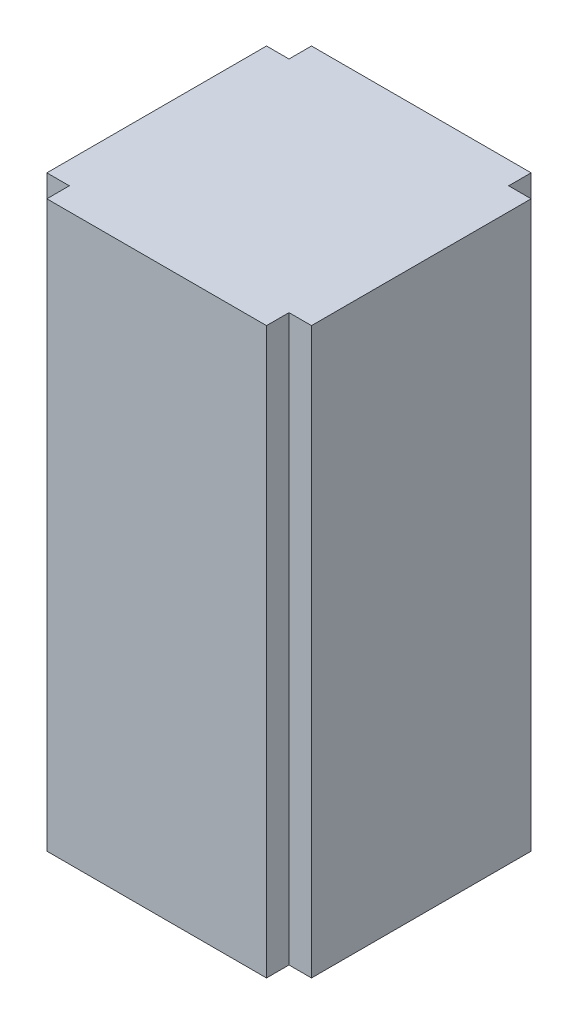
ISO-10303-21;
HEADER;
FILE_DESCRIPTION(('STEP AP214'),'2;1');
FILE_NAME('part.step','',(''),(''),'','','');
FILE_SCHEMA(('AUTOMOTIVE_DESIGN { 1 0 10303 214 1 1 1 1 }'));
ENDSEC;
DATA;
#1=APPLICATION_CONTEXT('core data for automotive mechanical design processes');
#2=APPLICATION_PROTOCOL_DEFINITION('international standard','automotive_design',2000,#1);
#3=PRODUCT_CONTEXT('',#1,'mechanical');
#4=PRODUCT('Part','Part','',(#3));
#5=PRODUCT_RELATED_PRODUCT_CATEGORY('part','',(#4));
#6=PRODUCT_DEFINITION_FORMATION('','',#4);
#7=PRODUCT_DEFINITION_CONTEXT('part definition',#1,'design');
#8=PRODUCT_DEFINITION('design','',#6,#7);
#9=PRODUCT_DEFINITION_SHAPE('','',#8);
#10=(LENGTH_UNIT() NAMED_UNIT(*) SI_UNIT(.MILLI.,.METRE.));
#11=(NAMED_UNIT(*) PLANE_ANGLE_UNIT() SI_UNIT($,.RADIAN.));
#12=(NAMED_UNIT(*) SI_UNIT($,.STERADIAN.) SOLID_ANGLE_UNIT());
#13=UNCERTAINTY_MEASURE_WITH_UNIT(LENGTH_MEASURE(1.E-05),#10,'distance_accuracy_value','');
#14=(GEOMETRIC_REPRESENTATION_CONTEXT(3) GLOBAL_UNCERTAINTY_ASSIGNED_CONTEXT((#13)) GLOBAL_UNIT_ASSIGNED_CONTEXT((#10,
#11,#12)) REPRESENTATION_CONTEXT('',''));
#15=CARTESIAN_POINT('',(0.,0.,0.));
#16=DIRECTION('',(0.,0.,1.));
#17=DIRECTION('',(1.,0.,0.));
#18=AXIS2_PLACEMENT_3D('',#15,#16,#17);
#19=CARTESIAN_POINT('',(-55.4091798352219,106.75,-39.8040981496071));
#20=DIRECTION('',(0.,0.,1.));
#21=DIRECTION('',(1.,0.,0.));
#22=AXIS2_PLACEMENT_3D('',#19,#20,#21);
#23=PLANE('',#22);
#24=DIRECTION('',(-1.,0.,0.));
#25=VECTOR('',#24,1.);
#26=CARTESIAN_POINT('',(-55.4091798352219,-106.75,-39.8040981496071));
#27=LINE('',#26,#25);
#28=CARTESIAN_POINT('',(-55.4091798352219,-106.75,-39.8040981496071));
#29=VERTEX_POINT('',#28);
#30=CARTESIAN_POINT('',(-63.9091798352219,-106.75,-39.8040981496071));
#31=VERTEX_POINT('',#30);
#32=EDGE_CURVE('E154',#29,#31,#27,.T.);
#33=ORIENTED_EDGE('',*,*,#32,.T.);
#34=DIRECTION('',(0.,-1.,0.));
#35=VECTOR('',#34,1.);
#36=CARTESIAN_POINT('',(-63.9091798352219,106.75,-39.8040981496071));
#37=LINE('',#36,#35);
#38=CARTESIAN_POINT('',(-63.9091798352219,106.75,-39.8040981496071));
#39=VERTEX_POINT('',#38);
#40=EDGE_CURVE('E11',#39,#31,#37,.T.);
#41=ORIENTED_EDGE('',*,*,#40,.F.);
#42=DIRECTION('',(-1.,0.,0.));
#43=VECTOR('',#42,1.);
#44=CARTESIAN_POINT('',(-55.4091798352219,106.75,-39.8040981496071));
#45=LINE('',#44,#43);
#46=CARTESIAN_POINT('',(-55.4091798352219,106.75,-39.8040981496071));
#47=VERTEX_POINT('',#46);
#48=EDGE_CURVE('E182',#47,#39,#45,.T.);
#49=ORIENTED_EDGE('',*,*,#48,.F.);
#50=DIRECTION('',(0.,-1.,0.));
#51=VECTOR('',#50,1.);
#52=CARTESIAN_POINT('',(-55.4091798352219,106.75,-39.8040981496071));
#53=LINE('',#52,#51);
#54=EDGE_CURVE('E49',#47,#29,#53,.T.);
#55=ORIENTED_EDGE('',*,*,#54,.T.);
#56=EDGE_LOOP('',(#33,#41,#49,#55));
#57=FACE_BOUND('',#56,.T.);
#58=ADVANCED_FACE('F33',(#57),#23,.F.);
#59=CARTESIAN_POINT('',(-63.9091798352219,106.75,-39.8040981496071));
#60=DIRECTION('',(1.,0.,0.));
#61=DIRECTION('',(0.,0.,-1.));
#62=AXIS2_PLACEMENT_3D('',#59,#60,#61);
#63=PLANE('',#62);
#64=DIRECTION('',(0.,0.,1.));
#65=VECTOR('',#64,1.);
#66=CARTESIAN_POINT('',(-63.9091798352219,-106.75,-39.8040981496071));
#67=LINE('',#66,#65);
#68=CARTESIAN_POINT('',(-63.9091798352219,-106.75,43.1959018503929));
#69=VERTEX_POINT('',#68);
#70=EDGE_CURVE('E156',#31,#69,#67,.T.);
#71=ORIENTED_EDGE('',*,*,#70,.T.);
#72=DIRECTION('',(0.,-1.,0.));
#73=VECTOR('',#72,1.);
#74=CARTESIAN_POINT('',(-63.9091798352219,106.75,43.1959018503929));
#75=LINE('',#74,#73);
#76=CARTESIAN_POINT('',(-63.9091798352219,106.75,43.1959018503929));
#77=VERTEX_POINT('',#76);
#78=EDGE_CURVE('E41',#77,#69,#75,.T.);
#79=ORIENTED_EDGE('',*,*,#78,.F.);
#80=DIRECTION('',(0.,0.,1.));
#81=VECTOR('',#80,1.);
#82=CARTESIAN_POINT('',(-63.9091798352219,106.75,-39.8040981496071));
#83=LINE('',#82,#81);
#84=EDGE_CURVE('E99',#39,#77,#83,.T.);
#85=ORIENTED_EDGE('',*,*,#84,.F.);
#86=ORIENTED_EDGE('',*,*,#40,.T.);
#87=EDGE_LOOP('',(#71,#79,#85,#86));
#88=FACE_BOUND('',#87,.T.);
#89=ADVANCED_FACE('F206',(#88),#63,.F.);
#90=CARTESIAN_POINT('',(-55.4091798352219,106.75,43.1959018503929));
#91=DIRECTION('',(0.,0.,1.));
#92=DIRECTION('',(1.,0.,0.));
#93=AXIS2_PLACEMENT_3D('',#90,#91,#92);
#94=PLANE('',#93);
#95=DIRECTION('',(-1.,0.,0.));
#96=VECTOR('',#95,1.);
#97=CARTESIAN_POINT('',(-55.4091798352219,-106.75,43.1959018503929));
#98=LINE('',#97,#96);
#99=CARTESIAN_POINT('',(-55.4091798352219,-106.75,43.1959018503929));
#100=VERTEX_POINT('',#99);
#101=EDGE_CURVE('E159',#100,#69,#98,.T.);
#102=ORIENTED_EDGE('',*,*,#101,.F.);
#103=DIRECTION('',(0.,-1.,0.));
#104=VECTOR('',#103,1.);
#105=CARTESIAN_POINT('',(-55.4091798352219,106.75,43.1959018503929));
#106=LINE('',#105,#104);
#107=CARTESIAN_POINT('',(-55.4091798352219,106.75,43.1959018503929));
#108=VERTEX_POINT('',#107);
#109=EDGE_CURVE('E199',#108,#100,#106,.T.);
#110=ORIENTED_EDGE('',*,*,#109,.F.);
#111=DIRECTION('',(-1.,0.,0.));
#112=VECTOR('',#111,1.);
#113=CARTESIAN_POINT('',(-55.4091798352219,106.75,43.1959018503929));
#114=LINE('',#113,#112);
#115=EDGE_CURVE('E205',#108,#77,#114,.T.);
#116=ORIENTED_EDGE('',*,*,#115,.T.);
#117=ORIENTED_EDGE('',*,*,#78,.T.);
#118=EDGE_LOOP('',(#102,#110,#116,#117));
#119=FACE_BOUND('',#118,.T.);
#120=ADVANCED_FACE('F203',(#119),#94,.T.);
#121=CARTESIAN_POINT('',(-55.4091798352219,106.75,43.1959018503929));
#122=DIRECTION('',(1.,0.,0.));
#123=DIRECTION('',(0.,0.,-1.));
#124=AXIS2_PLACEMENT_3D('',#121,#122,#123);
#125=PLANE('',#124);
#126=DIRECTION('',(0.,0.,1.));
#127=VECTOR('',#126,1.);
#128=CARTESIAN_POINT('',(-55.4091798352219,-106.75,43.1959018503929));
#129=LINE('',#128,#127);
#130=CARTESIAN_POINT('',(-55.4091798352219,-106.75,51.6959018503929));
#131=VERTEX_POINT('',#130);
#132=EDGE_CURVE('E162',#100,#131,#129,.T.);
#133=ORIENTED_EDGE('',*,*,#132,.T.);
#134=DIRECTION('',(0.,-1.,0.));
#135=VECTOR('',#134,1.);
#136=CARTESIAN_POINT('',(-55.4091798352219,106.75,51.6959018503929));
#137=LINE('',#136,#135);
#138=CARTESIAN_POINT('',(-55.4091798352219,106.75,51.6959018503929));
#139=VERTEX_POINT('',#138);
#140=EDGE_CURVE('E196',#139,#131,#137,.T.);
#141=ORIENTED_EDGE('',*,*,#140,.F.);
#142=DIRECTION('',(0.,0.,1.));
#143=VECTOR('',#142,1.);
#144=CARTESIAN_POINT('',(-55.4091798352219,106.75,43.1959018503929));
#145=LINE('',#144,#143);
#146=EDGE_CURVE('E224',#108,#139,#145,.T.);
#147=ORIENTED_EDGE('',*,*,#146,.F.);
#148=ORIENTED_EDGE('',*,*,#109,.T.);
#149=EDGE_LOOP('',(#133,#141,#147,#148));
#150=FACE_BOUND('',#149,.T.);
#151=ADVANCED_FACE('F215',(#150),#125,.F.);
#152=CARTESIAN_POINT('',(-55.4091798352219,106.75,51.6959018503929));
#153=DIRECTION('',(0.,0.,-1.));
#154=DIRECTION('',(-1.,0.,0.));
#155=AXIS2_PLACEMENT_3D('',#152,#153,#154);
#156=PLANE('',#155);
#157=DIRECTION('',(1.,0.,0.));
#158=VECTOR('',#157,1.);
#159=CARTESIAN_POINT('',(-55.4091798352219,-106.75,51.6959018503929));
#160=LINE('',#159,#158);
#161=CARTESIAN_POINT('',(27.5908201647781,-106.75,51.6959018503929));
#162=VERTEX_POINT('',#161);
#163=EDGE_CURVE('E164',#131,#162,#160,.T.);
#164=ORIENTED_EDGE('',*,*,#163,.T.);
#165=DIRECTION('',(0.,-1.,0.));
#166=VECTOR('',#165,1.);
#167=CARTESIAN_POINT('',(27.5908201647781,106.75,51.6959018503929));
#168=LINE('',#167,#166);
#169=CARTESIAN_POINT('',(27.5908201647781,106.75,51.6959018503929));
#170=VERTEX_POINT('',#169);
#171=EDGE_CURVE('E193',#170,#162,#168,.T.);
#172=ORIENTED_EDGE('',*,*,#171,.F.);
#173=DIRECTION('',(1.,0.,0.));
#174=VECTOR('',#173,1.);
#175=CARTESIAN_POINT('',(-55.4091798352219,106.75,51.6959018503929));
#176=LINE('',#175,#174);
#177=EDGE_CURVE('E221',#139,#170,#176,.T.);
#178=ORIENTED_EDGE('',*,*,#177,.F.);
#179=ORIENTED_EDGE('',*,*,#140,.T.);
#180=EDGE_LOOP('',(#164,#172,#178,#179));
#181=FACE_BOUND('',#180,.T.);
#182=ADVANCED_FACE('F219',(#181),#156,.F.);
#183=CARTESIAN_POINT('',(27.5908201647781,106.75,51.6959018503929));
#184=DIRECTION('',(-1.,0.,0.));
#185=DIRECTION('',(0.,0.,1.));
#186=AXIS2_PLACEMENT_3D('',#183,#184,#185);
#187=PLANE('',#186);
#188=DIRECTION('',(0.,0.,-1.));
#189=VECTOR('',#188,1.);
#190=CARTESIAN_POINT('',(27.5908201647781,-106.75,51.6959018503929));
#191=LINE('',#190,#189);
#192=CARTESIAN_POINT('',(27.5908201647781,-106.75,43.1959018503929));
#193=VERTEX_POINT('',#192);
#194=EDGE_CURVE('E166',#162,#193,#191,.T.);
#195=ORIENTED_EDGE('',*,*,#194,.T.);
#196=DIRECTION('',(0.,-1.,0.));
#197=VECTOR('',#196,1.);
#198=CARTESIAN_POINT('',(27.5908201647781,106.75,43.1959018503929));
#199=LINE('',#198,#197);
#200=CARTESIAN_POINT('',(27.5908201647781,106.75,43.1959018503929));
#201=VERTEX_POINT('',#200);
#202=EDGE_CURVE('E191',#201,#193,#199,.T.);
#203=ORIENTED_EDGE('',*,*,#202,.F.);
#204=DIRECTION('',(0.,0.,-1.));
#205=VECTOR('',#204,1.);
#206=CARTESIAN_POINT('',(27.5908201647781,106.75,51.6959018503929));
#207=LINE('',#206,#205);
#208=EDGE_CURVE('E223',#170,#201,#207,.T.);
#209=ORIENTED_EDGE('',*,*,#208,.F.);
#210=ORIENTED_EDGE('',*,*,#171,.T.);
#211=EDGE_LOOP('',(#195,#203,#209,#210));
#212=FACE_BOUND('',#211,.T.);
#213=ADVANCED_FACE('F268',(#212),#187,.F.);
#214=CARTESIAN_POINT('',(36.0908201647781,106.75,43.1959018503929));
#215=DIRECTION('',(0.,0.,1.));
#216=DIRECTION('',(1.,0.,0.));
#217=AXIS2_PLACEMENT_3D('',#214,#215,#216);
#218=PLANE('',#217);
#219=DIRECTION('',(-1.,0.,0.));
#220=VECTOR('',#219,1.);
#221=CARTESIAN_POINT('',(36.0908201647781,-106.75,43.1959018503929));
#222=LINE('',#221,#220);
#223=CARTESIAN_POINT('',(36.0908201647781,-106.75,43.1959018503929));
#224=VERTEX_POINT('',#223);
#225=EDGE_CURVE('E169',#224,#193,#222,.T.);
#226=ORIENTED_EDGE('',*,*,#225,.F.);
#227=DIRECTION('',(0.,-1.,0.));
#228=VECTOR('',#227,1.);
#229=CARTESIAN_POINT('',(36.0908201647781,106.75,43.1959018503929));
#230=LINE('',#229,#228);
#231=CARTESIAN_POINT('',(36.0908201647781,106.75,43.1959018503929));
#232=VERTEX_POINT('',#231);
#233=EDGE_CURVE('E189',#232,#224,#230,.T.);
#234=ORIENTED_EDGE('',*,*,#233,.F.);
#235=DIRECTION('',(-1.,0.,0.));
#236=VECTOR('',#235,1.);
#237=CARTESIAN_POINT('',(36.0908201647781,106.75,43.1959018503929));
#238=LINE('',#237,#236);
#239=EDGE_CURVE('E226',#232,#201,#238,.T.);
#240=ORIENTED_EDGE('',*,*,#239,.T.);
#241=ORIENTED_EDGE('',*,*,#202,.T.);
#242=EDGE_LOOP('',(#226,#234,#240,#241));
#243=FACE_BOUND('',#242,.T.);
#244=ADVANCED_FACE('F271',(#243),#218,.T.);
#245=CARTESIAN_POINT('',(36.0908201647781,106.75,43.1959018503929));
#246=DIRECTION('',(-1.,0.,0.));
#247=DIRECTION('',(0.,0.,1.));
#248=AXIS2_PLACEMENT_3D('',#245,#246,#247);
#249=PLANE('',#248);
#250=DIRECTION('',(0.,0.,-1.));
#251=VECTOR('',#250,1.);
#252=CARTESIAN_POINT('',(36.0908201647781,-106.75,43.1959018503929));
#253=LINE('',#252,#251);
#254=CARTESIAN_POINT('',(36.0908201647781,-106.75,-39.8040981496071));
#255=VERTEX_POINT('',#254);
#256=EDGE_CURVE('E172',#224,#255,#253,.T.);
#257=ORIENTED_EDGE('',*,*,#256,.T.);
#258=DIRECTION('',(0.,-1.,0.));
#259=VECTOR('',#258,1.);
#260=CARTESIAN_POINT('',(36.0908201647781,106.75,-39.8040981496071));
#261=LINE('',#260,#259);
#262=CARTESIAN_POINT('',(36.0908201647781,106.75,-39.8040981496071));
#263=VERTEX_POINT('',#262);
#264=EDGE_CURVE('E186',#263,#255,#261,.T.);
#265=ORIENTED_EDGE('',*,*,#264,.F.);
#266=DIRECTION('',(0.,0.,-1.));
#267=VECTOR('',#266,1.);
#268=CARTESIAN_POINT('',(36.0908201647781,106.75,43.1959018503929));
#269=LINE('',#268,#267);
#270=EDGE_CURVE('E233',#232,#263,#269,.T.);
#271=ORIENTED_EDGE('',*,*,#270,.F.);
#272=ORIENTED_EDGE('',*,*,#233,.T.);
#273=EDGE_LOOP('',(#257,#265,#271,#272));
#274=FACE_BOUND('',#273,.T.);
#275=ADVANCED_FACE('F238',(#274),#249,.F.);
#276=CARTESIAN_POINT('',(36.0908201647781,106.75,-39.8040981496071));
#277=DIRECTION('',(0.,0.,1.));
#278=DIRECTION('',(1.,0.,0.));
#279=AXIS2_PLACEMENT_3D('',#276,#277,#278);
#280=PLANE('',#279);
#281=DIRECTION('',(-1.,0.,0.));
#282=VECTOR('',#281,1.);
#283=CARTESIAN_POINT('',(36.0908201647781,-106.75,-39.8040981496071));
#284=LINE('',#283,#282);
#285=CARTESIAN_POINT('',(27.5908201647781,-106.75,-39.8040981496071));
#286=VERTEX_POINT('',#285);
#287=EDGE_CURVE('E174',#255,#286,#284,.T.);
#288=ORIENTED_EDGE('',*,*,#287,.T.);
#289=DIRECTION('',(0.,-1.,0.));
#290=VECTOR('',#289,1.);
#291=CARTESIAN_POINT('',(27.5908201647781,106.75,-39.8040981496071));
#292=LINE('',#291,#290);
#293=CARTESIAN_POINT('',(27.5908201647781,106.75,-39.8040981496071));
#294=VERTEX_POINT('',#293);
#295=EDGE_CURVE('E146',#294,#286,#292,.T.);
#296=ORIENTED_EDGE('',*,*,#295,.F.);
#297=DIRECTION('',(-1.,0.,0.));
#298=VECTOR('',#297,1.);
#299=CARTESIAN_POINT('',(36.0908201647781,106.75,-39.8040981496071));
#300=LINE('',#299,#298);
#301=EDGE_CURVE('E134',#263,#294,#300,.T.);
#302=ORIENTED_EDGE('',*,*,#301,.F.);
#303=ORIENTED_EDGE('',*,*,#264,.T.);
#304=EDGE_LOOP('',(#288,#296,#302,#303));
#305=FACE_BOUND('',#304,.T.);
#306=ADVANCED_FACE('F242',(#305),#280,.F.);
#307=CARTESIAN_POINT('',(27.5908201647781,106.75,-39.8040981496071));
#308=DIRECTION('',(-1.,0.,0.));
#309=DIRECTION('',(0.,0.,1.));
#310=AXIS2_PLACEMENT_3D('',#307,#308,#309);
#311=PLANE('',#310);
#312=DIRECTION('',(0.,0.,-1.));
#313=VECTOR('',#312,1.);
#314=CARTESIAN_POINT('',(27.5908201647781,-106.75,-39.8040981496071));
#315=LINE('',#314,#313);
#316=CARTESIAN_POINT('',(27.5908201647781,-106.75,-48.3040981496071));
#317=VERTEX_POINT('',#316);
#318=EDGE_CURVE('E143',#286,#317,#315,.T.);
#319=ORIENTED_EDGE('',*,*,#318,.T.);
#320=DIRECTION('',(0.,-1.,0.));
#321=VECTOR('',#320,1.);
#322=CARTESIAN_POINT('',(27.5908201647781,106.75,-48.3040981496071));
#323=LINE('',#322,#321);
#324=CARTESIAN_POINT('',(27.5908201647781,106.75,-48.3040981496071));
#325=VERTEX_POINT('',#324);
#326=EDGE_CURVE('E140',#325,#317,#323,.T.);
#327=ORIENTED_EDGE('',*,*,#326,.F.);
#328=DIRECTION('',(0.,0.,-1.));
#329=VECTOR('',#328,1.);
#330=CARTESIAN_POINT('',(27.5908201647781,106.75,-39.8040981496071));
#331=LINE('',#330,#329);
#332=EDGE_CURVE('E127',#294,#325,#331,.T.);
#333=ORIENTED_EDGE('',*,*,#332,.F.);
#334=ORIENTED_EDGE('',*,*,#295,.T.);
#335=EDGE_LOOP('',(#319,#327,#333,#334));
#336=FACE_BOUND('',#335,.T.);
#337=ADVANCED_FACE('F141',(#336),#311,.F.);
#338=CARTESIAN_POINT('',(-55.4091798352219,106.75,-48.3040981496071));
#339=DIRECTION('',(0.,0.,-1.));
#340=DIRECTION('',(-1.,0.,0.));
#341=AXIS2_PLACEMENT_3D('',#338,#339,#340);
#342=PLANE('',#341);
#343=DIRECTION('',(1.,0.,0.));
#344=VECTOR('',#343,1.);
#345=CARTESIAN_POINT('',(-55.4091798352219,-106.75,-48.3040981496071));
#346=LINE('',#345,#344);
#347=CARTESIAN_POINT('',(-55.4091798352219,-106.75,-48.3040981496071));
#348=VERTEX_POINT('',#347);
#349=EDGE_CURVE('E177',#348,#317,#346,.T.);
#350=ORIENTED_EDGE('',*,*,#349,.F.);
#351=DIRECTION('',(0.,-1.,0.));
#352=VECTOR('',#351,1.);
#353=CARTESIAN_POINT('',(-55.4091798352219,106.75,-48.3040981496071));
#354=LINE('',#353,#352);
#355=CARTESIAN_POINT('',(-55.4091798352219,106.75,-48.3040981496071));
#356=VERTEX_POINT('',#355);
#357=EDGE_CURVE('E87',#356,#348,#354,.T.);
#358=ORIENTED_EDGE('',*,*,#357,.F.);
#359=DIRECTION('',(1.,0.,0.));
#360=VECTOR('',#359,1.);
#361=CARTESIAN_POINT('',(-55.4091798352219,106.75,-48.3040981496071));
#362=LINE('',#361,#360);
#363=EDGE_CURVE('E132',#356,#325,#362,.T.);
#364=ORIENTED_EDGE('',*,*,#363,.T.);
#365=ORIENTED_EDGE('',*,*,#326,.T.);
#366=EDGE_LOOP('',(#350,#358,#364,#365));
#367=FACE_BOUND('',#366,.T.);
#368=ADVANCED_FACE('F148',(#367),#342,.T.);
#369=CARTESIAN_POINT('',(-55.4091798352219,106.75,-39.8040981496071));
#370=DIRECTION('',(-1.,0.,0.));
#371=DIRECTION('',(0.,0.,1.));
#372=AXIS2_PLACEMENT_3D('',#369,#370,#371);
#373=PLANE('',#372);
#374=DIRECTION('',(0.,0.,-1.));
#375=VECTOR('',#374,1.);
#376=CARTESIAN_POINT('',(-55.4091798352219,-106.75,-39.8040981496071));
#377=LINE('',#376,#375);
#378=EDGE_CURVE('E179',#29,#348,#377,.T.);
#379=ORIENTED_EDGE('',*,*,#378,.F.);
#380=ORIENTED_EDGE('',*,*,#54,.F.);
#381=DIRECTION('',(0.,0.,-1.));
#382=VECTOR('',#381,1.);
#383=CARTESIAN_POINT('',(-55.4091798352219,106.75,-39.8040981496071));
#384=LINE('',#383,#382);
#385=EDGE_CURVE('E149',#47,#356,#384,.T.);
#386=ORIENTED_EDGE('',*,*,#385,.T.);
#387=ORIENTED_EDGE('',*,*,#357,.T.);
#388=EDGE_LOOP('',(#379,#380,#386,#387));
#389=FACE_BOUND('',#388,.T.);
#390=ADVANCED_FACE('F243',(#389),#373,.T.);
#391=CARTESIAN_POINT('',(0.,106.75,0.));
#392=DIRECTION('',(0.,1.,0.));
#393=DIRECTION('',(0.,0.,1.));
#394=AXIS2_PLACEMENT_3D('',#391,#392,#393);
#395=PLANE('',#394);
#396=ORIENTED_EDGE('',*,*,#48,.T.);
#397=ORIENTED_EDGE('',*,*,#84,.T.);
#398=ORIENTED_EDGE('',*,*,#115,.F.);
#399=ORIENTED_EDGE('',*,*,#146,.T.);
#400=ORIENTED_EDGE('',*,*,#177,.T.);
#401=ORIENTED_EDGE('',*,*,#208,.T.);
#402=ORIENTED_EDGE('',*,*,#239,.F.);
#403=ORIENTED_EDGE('',*,*,#270,.T.);
#404=ORIENTED_EDGE('',*,*,#301,.T.);
#405=ORIENTED_EDGE('',*,*,#332,.T.);
#406=ORIENTED_EDGE('',*,*,#363,.F.);
#407=ORIENTED_EDGE('',*,*,#385,.F.);
#408=EDGE_LOOP('',(#396,#397,#398,#399,#400,#401,#402,#403,#404,#405,#406,#407));
#409=FACE_BOUND('',#408,.T.);
#410=ADVANCED_FACE('F129',(#409),#395,.T.);
#411=CARTESIAN_POINT('',(0.,-106.75,0.));
#412=DIRECTION('',(0.,1.,0.));
#413=DIRECTION('',(0.,0.,1.));
#414=AXIS2_PLACEMENT_3D('',#411,#412,#413);
#415=PLANE('',#414);
#416=ORIENTED_EDGE('',*,*,#32,.F.);
#417=ORIENTED_EDGE('',*,*,#378,.T.);
#418=ORIENTED_EDGE('',*,*,#349,.T.);
#419=ORIENTED_EDGE('',*,*,#318,.F.);
#420=ORIENTED_EDGE('',*,*,#287,.F.);
#421=ORIENTED_EDGE('',*,*,#256,.F.);
#422=ORIENTED_EDGE('',*,*,#225,.T.);
#423=ORIENTED_EDGE('',*,*,#194,.F.);
#424=ORIENTED_EDGE('',*,*,#163,.F.);
#425=ORIENTED_EDGE('',*,*,#132,.F.);
#426=ORIENTED_EDGE('',*,*,#101,.T.);
#427=ORIENTED_EDGE('',*,*,#70,.F.);
#428=EDGE_LOOP('',(#416,#417,#418,#419,#420,#421,#422,#423,#424,#425,#426,#427));
#429=FACE_BOUND('',#428,.T.);
#430=ADVANCED_FACE('F210',(#429),#415,.F.);
#431=CLOSED_SHELL('',(#58,#89,#120,#151,#182,#213,#244,#275,#306,#337,#368,#390,#410,#430));
#432=MANIFOLD_SOLID_BREP('B2',#431);
#433=ADVANCED_BREP_SHAPE_REPRESENTATION('',(#18,#432),#14);
#434=SHAPE_DEFINITION_REPRESENTATION(#9,#433);
ENDSEC;
END-ISO-10303-21;
